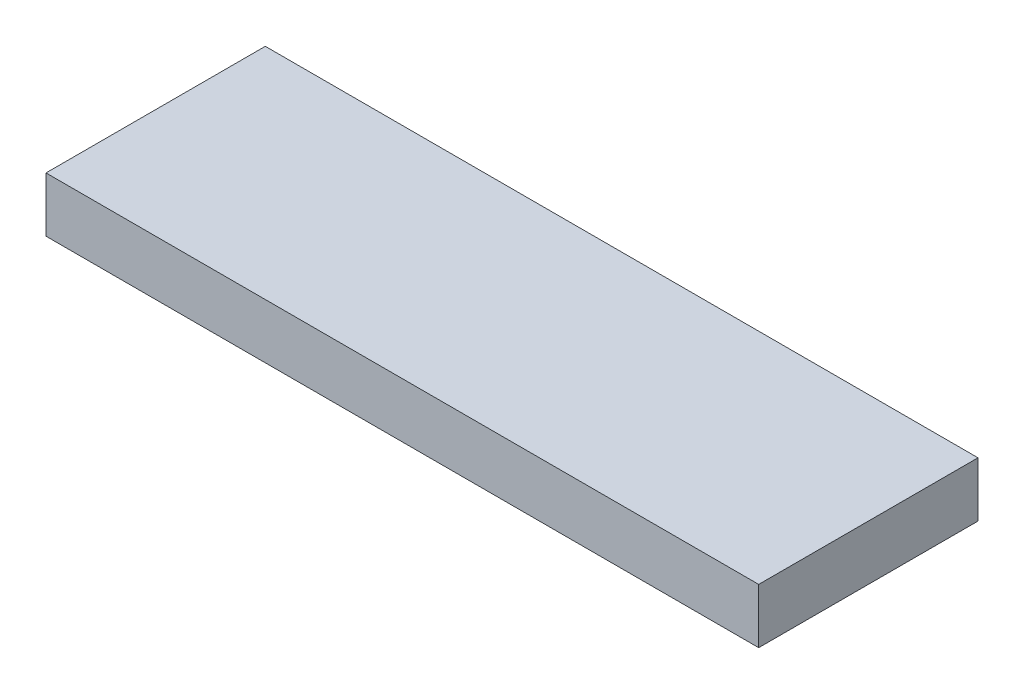
ISO-10303-21;
HEADER;
FILE_DESCRIPTION(('STEP AP214'),'2;1');
FILE_NAME('part.step','',(''),(''),'','','');
FILE_SCHEMA(('AUTOMOTIVE_DESIGN { 1 0 10303 214 1 1 1 1 }'));
ENDSEC;
DATA;
#1=APPLICATION_CONTEXT('core data for automotive mechanical design processes');
#2=APPLICATION_PROTOCOL_DEFINITION('international standard','automotive_design',2000,#1);
#3=PRODUCT_CONTEXT('',#1,'mechanical');
#4=PRODUCT('Part','Part','',(#3));
#5=PRODUCT_RELATED_PRODUCT_CATEGORY('part','',(#4));
#6=PRODUCT_DEFINITION_FORMATION('','',#4);
#7=PRODUCT_DEFINITION_CONTEXT('part definition',#1,'design');
#8=PRODUCT_DEFINITION('design','',#6,#7);
#9=PRODUCT_DEFINITION_SHAPE('','',#8);
#10=(LENGTH_UNIT() NAMED_UNIT(*) SI_UNIT(.MILLI.,.METRE.));
#11=(NAMED_UNIT(*) PLANE_ANGLE_UNIT() SI_UNIT($,.RADIAN.));
#12=(NAMED_UNIT(*) SI_UNIT($,.STERADIAN.) SOLID_ANGLE_UNIT());
#13=UNCERTAINTY_MEASURE_WITH_UNIT(LENGTH_MEASURE(1.E-05),#10,'distance_accuracy_value','');
#14=(GEOMETRIC_REPRESENTATION_CONTEXT(3) GLOBAL_UNCERTAINTY_ASSIGNED_CONTEXT((#13)) GLOBAL_UNIT_ASSIGNED_CONTEXT((#10,
#11,#12)) REPRESENTATION_CONTEXT('',''));
#15=CARTESIAN_POINT('',(0.,0.,0.));
#16=DIRECTION('',(0.,0.,1.));
#17=DIRECTION('',(1.,0.,0.));
#18=AXIS2_PLACEMENT_3D('',#15,#16,#17);
#19=CARTESIAN_POINT('',(-6.5,1.,2.));
#20=DIRECTION('',(-1.,0.,0.));
#21=DIRECTION('',(0.,0.,1.));
#22=AXIS2_PLACEMENT_3D('',#19,#20,#21);
#23=PLANE('',#22);
#24=DIRECTION('',(0.,0.,-1.));
#25=VECTOR('',#24,1.);
#26=CARTESIAN_POINT('',(-6.5,0.,2.));
#27=LINE('',#26,#25);
#28=CARTESIAN_POINT('',(-6.5,0.,2.));
#29=VERTEX_POINT('',#28);
#30=CARTESIAN_POINT('',(-6.5,0.,-2.));
#31=VERTEX_POINT('',#30);
#32=EDGE_CURVE('E97',#29,#31,#27,.T.);
#33=ORIENTED_EDGE('',*,*,#32,.F.);
#34=DIRECTION('',(0.,-1.,0.));
#35=VECTOR('',#34,1.);
#36=CARTESIAN_POINT('',(-6.5,1.,2.));
#37=LINE('',#36,#35);
#38=CARTESIAN_POINT('',(-6.5,1.,2.));
#39=VERTEX_POINT('',#38);
#40=EDGE_CURVE('E11',#39,#29,#37,.T.);
#41=ORIENTED_EDGE('',*,*,#40,.F.);
#42=DIRECTION('',(0.,0.,-1.));
#43=VECTOR('',#42,1.);
#44=CARTESIAN_POINT('',(-6.5,1.,2.));
#45=LINE('',#44,#43);
#46=CARTESIAN_POINT('',(-6.5,1.,-2.));
#47=VERTEX_POINT('',#46);
#48=EDGE_CURVE('E92',#39,#47,#45,.T.);
#49=ORIENTED_EDGE('',*,*,#48,.T.);
#50=DIRECTION('',(0.,-1.,0.));
#51=VECTOR('',#50,1.);
#52=CARTESIAN_POINT('',(-6.5,1.,-2.));
#53=LINE('',#52,#51);
#54=EDGE_CURVE('E35',#47,#31,#53,.T.);
#55=ORIENTED_EDGE('',*,*,#54,.T.);
#56=EDGE_LOOP('',(#33,#41,#49,#55));
#57=FACE_BOUND('',#56,.T.);
#58=ADVANCED_FACE('F32',(#57),#23,.T.);
#59=CARTESIAN_POINT('',(-6.5,1.,2.));
#60=DIRECTION('',(0.,0.,-1.));
#61=DIRECTION('',(-1.,0.,0.));
#62=AXIS2_PLACEMENT_3D('',#59,#60,#61);
#63=PLANE('',#62);
#64=DIRECTION('',(1.,0.,0.));
#65=VECTOR('',#64,1.);
#66=CARTESIAN_POINT('',(-6.5,0.,2.));
#67=LINE('',#66,#65);
#68=CARTESIAN_POINT('',(6.5,0.,2.));
#69=VERTEX_POINT('',#68);
#70=EDGE_CURVE('E65',#29,#69,#67,.T.);
#71=ORIENTED_EDGE('',*,*,#70,.T.);
#72=DIRECTION('',(0.,-1.,0.));
#73=VECTOR('',#72,1.);
#74=CARTESIAN_POINT('',(6.5,1.,2.));
#75=LINE('',#74,#73);
#76=CARTESIAN_POINT('',(6.5,1.,2.));
#77=VERTEX_POINT('',#76);
#78=EDGE_CURVE('E41',#77,#69,#75,.T.);
#79=ORIENTED_EDGE('',*,*,#78,.F.);
#80=DIRECTION('',(1.,0.,0.));
#81=VECTOR('',#80,1.);
#82=CARTESIAN_POINT('',(-6.5,1.,2.));
#83=LINE('',#82,#81);
#84=EDGE_CURVE('E82',#39,#77,#83,.T.);
#85=ORIENTED_EDGE('',*,*,#84,.F.);
#86=ORIENTED_EDGE('',*,*,#40,.T.);
#87=EDGE_LOOP('',(#71,#79,#85,#86));
#88=FACE_BOUND('',#87,.T.);
#89=ADVANCED_FACE('F107',(#88),#63,.F.);
#90=CARTESIAN_POINT('',(6.5,1.,2.));
#91=DIRECTION('',(-1.,0.,0.));
#92=DIRECTION('',(0.,0.,1.));
#93=AXIS2_PLACEMENT_3D('',#90,#91,#92);
#94=PLANE('',#93);
#95=DIRECTION('',(0.,0.,-1.));
#96=VECTOR('',#95,1.);
#97=CARTESIAN_POINT('',(6.5,0.,2.));
#98=LINE('',#97,#96);
#99=CARTESIAN_POINT('',(6.5,0.,-2.));
#100=VERTEX_POINT('',#99);
#101=EDGE_CURVE('E89',#69,#100,#98,.T.);
#102=ORIENTED_EDGE('',*,*,#101,.T.);
#103=DIRECTION('',(0.,-1.,0.));
#104=VECTOR('',#103,1.);
#105=CARTESIAN_POINT('',(6.5,1.,-2.));
#106=LINE('',#105,#104);
#107=CARTESIAN_POINT('',(6.5,1.,-2.));
#108=VERTEX_POINT('',#107);
#109=EDGE_CURVE('E86',#108,#100,#106,.T.);
#110=ORIENTED_EDGE('',*,*,#109,.F.);
#111=DIRECTION('',(0.,0.,-1.));
#112=VECTOR('',#111,1.);
#113=CARTESIAN_POINT('',(6.5,1.,2.));
#114=LINE('',#113,#112);
#115=EDGE_CURVE('E77',#77,#108,#114,.T.);
#116=ORIENTED_EDGE('',*,*,#115,.F.);
#117=ORIENTED_EDGE('',*,*,#78,.T.);
#118=EDGE_LOOP('',(#102,#110,#116,#117));
#119=FACE_BOUND('',#118,.T.);
#120=ADVANCED_FACE('F87',(#119),#94,.F.);
#121=CARTESIAN_POINT('',(-6.5,1.,-2.));
#122=DIRECTION('',(0.,0.,-1.));
#123=DIRECTION('',(-1.,0.,0.));
#124=AXIS2_PLACEMENT_3D('',#121,#122,#123);
#125=PLANE('',#124);
#126=DIRECTION('',(1.,0.,0.));
#127=VECTOR('',#126,1.);
#128=CARTESIAN_POINT('',(-6.5,0.,-2.));
#129=LINE('',#128,#127);
#130=EDGE_CURVE('E100',#31,#100,#129,.T.);
#131=ORIENTED_EDGE('',*,*,#130,.F.);
#132=ORIENTED_EDGE('',*,*,#54,.F.);
#133=DIRECTION('',(1.,0.,0.));
#134=VECTOR('',#133,1.);
#135=CARTESIAN_POINT('',(-6.5,1.,-2.));
#136=LINE('',#135,#134);
#137=EDGE_CURVE('E81',#47,#108,#136,.T.);
#138=ORIENTED_EDGE('',*,*,#137,.T.);
#139=ORIENTED_EDGE('',*,*,#109,.T.);
#140=EDGE_LOOP('',(#131,#132,#138,#139));
#141=FACE_BOUND('',#140,.T.);
#142=ADVANCED_FACE('F91',(#141),#125,.T.);
#143=CARTESIAN_POINT('',(0.,1.,0.));
#144=DIRECTION('',(0.,-1.,0.));
#145=DIRECTION('',(0.,0.,-1.));
#146=AXIS2_PLACEMENT_3D('',#143,#144,#145);
#147=PLANE('',#146);
#148=ORIENTED_EDGE('',*,*,#48,.F.);
#149=ORIENTED_EDGE('',*,*,#84,.T.);
#150=ORIENTED_EDGE('',*,*,#115,.T.);
#151=ORIENTED_EDGE('',*,*,#137,.F.);
#152=EDGE_LOOP('',(#148,#149,#150,#151));
#153=FACE_BOUND('',#152,.T.);
#154=ADVANCED_FACE('F80',(#153),#147,.F.);
#155=CARTESIAN_POINT('',(0.,0.,0.));
#156=DIRECTION('',(0.,-1.,0.));
#157=DIRECTION('',(0.,0.,-1.));
#158=AXIS2_PLACEMENT_3D('',#155,#156,#157);
#159=PLANE('',#158);
#160=ORIENTED_EDGE('',*,*,#32,.T.);
#161=ORIENTED_EDGE('',*,*,#130,.T.);
#162=ORIENTED_EDGE('',*,*,#101,.F.);
#163=ORIENTED_EDGE('',*,*,#70,.F.);
#164=EDGE_LOOP('',(#160,#161,#162,#163));
#165=FACE_BOUND('',#164,.T.);
#166=ADVANCED_FACE('F105',(#165),#159,.T.);
#167=CLOSED_SHELL('',(#58,#89,#120,#142,#154,#166));
#168=MANIFOLD_SOLID_BREP('B2',#167);
#169=ADVANCED_BREP_SHAPE_REPRESENTATION('',(#18,#168),#14);
#170=SHAPE_DEFINITION_REPRESENTATION(#9,#169);
ENDSEC;
END-ISO-10303-21;
